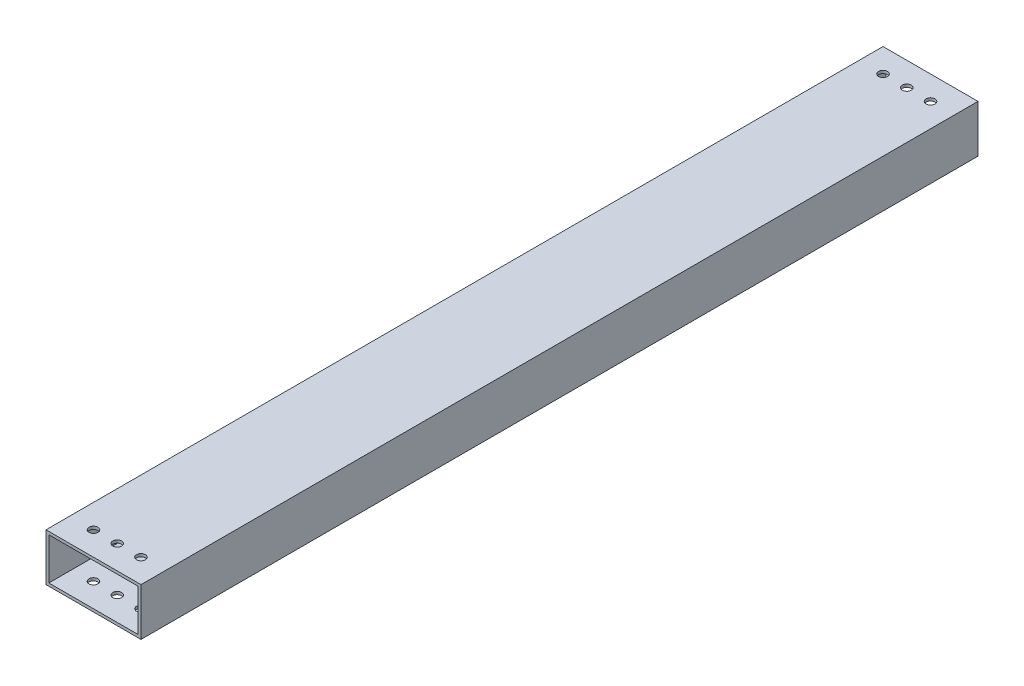
ISO-10303-21;
HEADER;
FILE_DESCRIPTION(('STEP AP214'),'2;1');
FILE_NAME('part.step','',(''),(''),'','','');
FILE_SCHEMA(('AUTOMOTIVE_DESIGN { 1 0 10303 214 1 1 1 1 }'));
ENDSEC;
DATA;
#1=APPLICATION_CONTEXT('core data for automotive mechanical design processes');
#2=APPLICATION_PROTOCOL_DEFINITION('international standard','automotive_design',2000,#1);
#3=PRODUCT_CONTEXT('',#1,'mechanical');
#4=PRODUCT('Part','Part','',(#3));
#5=PRODUCT_RELATED_PRODUCT_CATEGORY('part','',(#4));
#6=PRODUCT_DEFINITION_FORMATION('','',#4);
#7=PRODUCT_DEFINITION_CONTEXT('part definition',#1,'design');
#8=PRODUCT_DEFINITION('design','',#6,#7);
#9=PRODUCT_DEFINITION_SHAPE('','',#8);
#10=(LENGTH_UNIT() NAMED_UNIT(*) SI_UNIT(.MILLI.,.METRE.));
#11=(NAMED_UNIT(*) PLANE_ANGLE_UNIT() SI_UNIT($,.RADIAN.));
#12=(NAMED_UNIT(*) SI_UNIT($,.STERADIAN.) SOLID_ANGLE_UNIT());
#13=UNCERTAINTY_MEASURE_WITH_UNIT(LENGTH_MEASURE(1.E-05),#10,'distance_accuracy_value','');
#14=(GEOMETRIC_REPRESENTATION_CONTEXT(3) GLOBAL_UNCERTAINTY_ASSIGNED_CONTEXT((#13)) GLOBAL_UNIT_ASSIGNED_CONTEXT((#10,
#11,#12)) REPRESENTATION_CONTEXT('',''));
#15=CARTESIAN_POINT('',(0.,0.,0.));
#16=DIRECTION('',(0.,0.,1.));
#17=DIRECTION('',(1.,0.,0.));
#18=AXIS2_PLACEMENT_3D('',#15,#16,#17);
#19=CARTESIAN_POINT('',(0.,25.4,447.675));
#20=DIRECTION('',(0.,-1.,0.));
#21=DIRECTION('',(1.,0.,0.));
#22=AXIS2_PLACEMENT_3D('',#19,#20,#21);
#23=PLANE('',#22);
#24=CARTESIAN_POINT('',(-25.4,25.4,434.975));
#25=DIRECTION('',(0.,-1.,0.));
#26=DIRECTION('',(1.,0.,0.));
#27=AXIS2_PLACEMENT_3D('',#24,#25,#26);
#28=CIRCLE('',#27,2.38125000000003);
#29=CARTESIAN_POINT('',(-23.01875,25.4,434.975));
#30=VERTEX_POINT('',#29);
#31=EDGE_CURVE('E141',#30,#30,#28,.T.);
#32=ORIENTED_EDGE('',*,*,#31,.T.);
#33=EDGE_LOOP('',(#32));
#34=FACE_BOUND('',#33,.T.);
#35=CARTESIAN_POINT('',(-12.7,25.4,434.975));
#36=DIRECTION('',(0.,-1.,0.));
#37=DIRECTION('',(1.,0.,0.));
#38=AXIS2_PLACEMENT_3D('',#35,#36,#37);
#39=CIRCLE('',#38,2.38125000000003);
#40=CARTESIAN_POINT('',(-10.31875,25.4,434.975));
#41=VERTEX_POINT('',#40);
#42=EDGE_CURVE('E229',#41,#41,#39,.T.);
#43=ORIENTED_EDGE('',*,*,#42,.T.);
#44=EDGE_LOOP('',(#43));
#45=FACE_BOUND('',#44,.T.);
#46=CARTESIAN_POINT('',(-38.1,25.4,434.975));
#47=DIRECTION('',(0.,-1.,0.));
#48=DIRECTION('',(1.,0.,0.));
#49=AXIS2_PLACEMENT_3D('',#46,#47,#48);
#50=CIRCLE('',#49,2.38125000000002);
#51=CARTESIAN_POINT('',(-35.71875,25.4,434.975));
#52=VERTEX_POINT('',#51);
#53=EDGE_CURVE('E207',#52,#52,#50,.T.);
#54=ORIENTED_EDGE('',*,*,#53,.T.);
#55=EDGE_LOOP('',(#54));
#56=FACE_BOUND('',#55,.T.);
#57=DIRECTION('',(-1.,0.,0.));
#58=VECTOR('',#57,1.);
#59=CARTESIAN_POINT('',(0.,25.4,0.));
#60=LINE('',#59,#58);
#61=CARTESIAN_POINT('',(0.,25.4,0.));
#62=VERTEX_POINT('',#61);
#63=CARTESIAN_POINT('',(-50.8,25.4,0.));
#64=VERTEX_POINT('',#63);
#65=EDGE_CURVE('E178',#62,#64,#60,.T.);
#66=ORIENTED_EDGE('',*,*,#65,.T.);
#67=DIRECTION('',(0.,0.,-1.));
#68=VECTOR('',#67,1.);
#69=CARTESIAN_POINT('',(-50.8,25.4,447.675));
#70=LINE('',#69,#68);
#71=CARTESIAN_POINT('',(-50.8,25.4,447.675));
#72=VERTEX_POINT('',#71);
#73=EDGE_CURVE('E49',#72,#64,#70,.T.);
#74=ORIENTED_EDGE('',*,*,#73,.F.);
#75=DIRECTION('',(-1.,0.,0.));
#76=VECTOR('',#75,1.);
#77=CARTESIAN_POINT('',(0.,25.4,447.675));
#78=LINE('',#77,#76);
#79=CARTESIAN_POINT('',(0.,25.4,447.675));
#80=VERTEX_POINT('',#79);
#81=EDGE_CURVE('E162',#80,#72,#78,.T.);
#82=ORIENTED_EDGE('',*,*,#81,.F.);
#83=DIRECTION('',(0.,0.,-1.));
#84=VECTOR('',#83,1.);
#85=CARTESIAN_POINT('',(0.,25.4,447.675));
#86=LINE('',#85,#84);
#87=EDGE_CURVE('E11',#80,#62,#86,.T.);
#88=ORIENTED_EDGE('',*,*,#87,.T.);
#89=EDGE_LOOP('',(#66,#74,#82,#88));
#90=FACE_BOUND('',#89,.T.);
#91=CARTESIAN_POINT('',(-12.7,25.4,12.7));
#92=DIRECTION('',(0.,-1.,0.));
#93=DIRECTION('',(1.,0.,0.));
#94=AXIS2_PLACEMENT_3D('',#91,#92,#93);
#95=CIRCLE('',#94,2.38125000000003);
#96=CARTESIAN_POINT('',(-10.31875,25.4,12.7));
#97=VERTEX_POINT('',#96);
#98=EDGE_CURVE('E213',#97,#97,#95,.F.);
#99=ORIENTED_EDGE('',*,*,#98,.F.);
#100=EDGE_LOOP('',(#99));
#101=FACE_BOUND('',#100,.T.);
#102=CARTESIAN_POINT('',(-25.4,25.4,12.7));
#103=DIRECTION('',(0.,-1.,0.));
#104=DIRECTION('',(1.,0.,0.));
#105=AXIS2_PLACEMENT_3D('',#102,#103,#104);
#106=CIRCLE('',#105,2.38125000000003);
#107=CARTESIAN_POINT('',(-23.01875,25.4,12.7));
#108=VERTEX_POINT('',#107);
#109=EDGE_CURVE('E218',#108,#108,#106,.F.);
#110=ORIENTED_EDGE('',*,*,#109,.F.);
#111=EDGE_LOOP('',(#110));
#112=FACE_BOUND('',#111,.T.);
#113=CARTESIAN_POINT('',(-38.1,25.4,12.7));
#114=DIRECTION('',(0.,-1.,0.));
#115=DIRECTION('',(1.,0.,0.));
#116=AXIS2_PLACEMENT_3D('',#113,#114,#115);
#117=CIRCLE('',#116,2.38125000000002);
#118=CARTESIAN_POINT('',(-35.71875,25.4,12.7));
#119=VERTEX_POINT('',#118);
#120=EDGE_CURVE('E223',#119,#119,#117,.F.);
#121=ORIENTED_EDGE('',*,*,#120,.F.);
#122=EDGE_LOOP('',(#121));
#123=FACE_BOUND('',#122,.T.);
#124=ADVANCED_FACE('F39',(#34,#45,#56,#90,#101,#112,#123),#23,.F.);
#125=CARTESIAN_POINT('',(0.,0.,447.675));
#126=DIRECTION('',(0.,-1.,0.));
#127=DIRECTION('',(0.,0.,-1.));
#128=AXIS2_PLACEMENT_3D('',#125,#126,#127);
#129=PLANE('',#128);
#130=CARTESIAN_POINT('',(-25.4,0.,434.975));
#131=DIRECTION('',(0.,1.,0.));
#132=DIRECTION('',(-1.,0.,0.));
#133=AXIS2_PLACEMENT_3D('',#130,#131,#132);
#134=CIRCLE('',#133,2.38125000000003);
#135=CARTESIAN_POINT('',(-27.78125,0.,434.975));
#136=VERTEX_POINT('',#135);
#137=EDGE_CURVE('E339',#136,#136,#134,.T.);
#138=ORIENTED_EDGE('',*,*,#137,.T.);
#139=EDGE_LOOP('',(#138));
#140=FACE_BOUND('',#139,.T.);
#141=CARTESIAN_POINT('',(-12.7,0.,434.975));
#142=DIRECTION('',(0.,1.,0.));
#143=DIRECTION('',(-1.,0.,0.));
#144=AXIS2_PLACEMENT_3D('',#141,#142,#143);
#145=CIRCLE('',#144,2.38125000000003);
#146=CARTESIAN_POINT('',(-15.08125,0.,434.975));
#147=VERTEX_POINT('',#146);
#148=EDGE_CURVE('E333',#147,#147,#145,.T.);
#149=ORIENTED_EDGE('',*,*,#148,.T.);
#150=EDGE_LOOP('',(#149));
#151=FACE_BOUND('',#150,.T.);
#152=CARTESIAN_POINT('',(-25.4,0.,12.7));
#153=DIRECTION('',(0.,-1.,0.));
#154=DIRECTION('',(1.,0.,0.));
#155=AXIS2_PLACEMENT_3D('',#152,#153,#154);
#156=CIRCLE('',#155,2.38125000000003);
#157=CARTESIAN_POINT('',(-23.01875,0.,12.7));
#158=VERTEX_POINT('',#157);
#159=EDGE_CURVE('E334',#158,#158,#156,.T.);
#160=ORIENTED_EDGE('',*,*,#159,.F.);
#161=EDGE_LOOP('',(#160));
#162=FACE_BOUND('',#161,.T.);
#163=DIRECTION('',(-1.,0.,0.));
#164=VECTOR('',#163,1.);
#165=CARTESIAN_POINT('',(0.,0.,0.));
#166=LINE('',#165,#164);
#167=CARTESIAN_POINT('',(0.,0.,0.));
#168=VERTEX_POINT('',#167);
#169=CARTESIAN_POINT('',(-50.8,0.,0.));
#170=VERTEX_POINT('',#169);
#171=EDGE_CURVE('E163',#168,#170,#166,.T.);
#172=ORIENTED_EDGE('',*,*,#171,.F.);
#173=DIRECTION('',(0.,0.,-1.));
#174=VECTOR('',#173,1.);
#175=CARTESIAN_POINT('',(0.,0.,447.675));
#176=LINE('',#175,#174);
#177=CARTESIAN_POINT('',(0.,0.,447.675));
#178=VERTEX_POINT('',#177);
#179=EDGE_CURVE('E174',#178,#168,#176,.T.);
#180=ORIENTED_EDGE('',*,*,#179,.F.);
#181=DIRECTION('',(-1.,0.,0.));
#182=VECTOR('',#181,1.);
#183=CARTESIAN_POINT('',(0.,0.,447.675));
#184=LINE('',#183,#182);
#185=CARTESIAN_POINT('',(-50.8,0.,447.675));
#186=VERTEX_POINT('',#185);
#187=EDGE_CURVE('E170',#178,#186,#184,.T.);
#188=ORIENTED_EDGE('',*,*,#187,.T.);
#189=DIRECTION('',(0.,0.,-1.));
#190=VECTOR('',#189,1.);
#191=CARTESIAN_POINT('',(-50.8,0.,447.675));
#192=LINE('',#191,#190);
#193=EDGE_CURVE('E191',#186,#170,#192,.T.);
#194=ORIENTED_EDGE('',*,*,#193,.T.);
#195=EDGE_LOOP('',(#172,#180,#188,#194));
#196=FACE_BOUND('',#195,.T.);
#197=CARTESIAN_POINT('',(-38.1,0.,434.975));
#198=DIRECTION('',(0.,1.,0.));
#199=DIRECTION('',(-1.,0.,0.));
#200=AXIS2_PLACEMENT_3D('',#197,#198,#199);
#201=CIRCLE('',#200,2.38125000000002);
#202=CARTESIAN_POINT('',(-40.48125,0.,434.975));
#203=VERTEX_POINT('',#202);
#204=EDGE_CURVE('E201',#203,#203,#201,.T.);
#205=ORIENTED_EDGE('',*,*,#204,.T.);
#206=EDGE_LOOP('',(#205));
#207=FACE_BOUND('',#206,.T.);
#208=CARTESIAN_POINT('',(-12.7,0.,12.7));
#209=DIRECTION('',(0.,-1.,0.));
#210=DIRECTION('',(1.,0.,0.));
#211=AXIS2_PLACEMENT_3D('',#208,#209,#210);
#212=CIRCLE('',#211,2.38125000000003);
#213=CARTESIAN_POINT('',(-10.31875,0.,12.7));
#214=VERTEX_POINT('',#213);
#215=EDGE_CURVE('E342',#214,#214,#212,.T.);
#216=ORIENTED_EDGE('',*,*,#215,.F.);
#217=EDGE_LOOP('',(#216));
#218=FACE_BOUND('',#217,.T.);
#219=CARTESIAN_POINT('',(-38.1,0.,12.7));
#220=DIRECTION('',(0.,-1.,0.));
#221=DIRECTION('',(1.,0.,0.));
#222=AXIS2_PLACEMENT_3D('',#219,#220,#221);
#223=CIRCLE('',#222,2.38125000000002);
#224=CARTESIAN_POINT('',(-35.71875,0.,12.7));
#225=VERTEX_POINT('',#224);
#226=EDGE_CURVE('E328',#225,#225,#223,.T.);
#227=ORIENTED_EDGE('',*,*,#226,.F.);
#228=EDGE_LOOP('',(#227));
#229=FACE_BOUND('',#228,.T.);
#230=ADVANCED_FACE('F270',(#140,#151,#162,#196,#207,#218,#229),#129,.T.);
#231=CARTESIAN_POINT('',(0.,23.876,447.675));
#232=DIRECTION('',(0.,-1.,0.));
#233=DIRECTION('',(1.,0.,0.));
#234=AXIS2_PLACEMENT_3D('',#231,#232,#233);
#235=PLANE('',#234);
#236=CARTESIAN_POINT('',(-25.4,23.876,434.975));
#237=DIRECTION('',(0.,-1.,0.));
#238=DIRECTION('',(1.,0.,0.));
#239=AXIS2_PLACEMENT_3D('',#236,#237,#238);
#240=CIRCLE('',#239,2.38125000000003);
#241=CARTESIAN_POINT('',(-23.01875,23.876,434.975));
#242=VERTEX_POINT('',#241);
#243=EDGE_CURVE('E243',#242,#242,#240,.T.);
#244=ORIENTED_EDGE('',*,*,#243,.F.);
#245=EDGE_LOOP('',(#244));
#246=FACE_BOUND('',#245,.T.);
#247=CARTESIAN_POINT('',(-12.7,23.876,434.975));
#248=DIRECTION('',(0.,-1.,0.));
#249=DIRECTION('',(1.,0.,0.));
#250=AXIS2_PLACEMENT_3D('',#247,#248,#249);
#251=CIRCLE('',#250,2.38125000000003);
#252=CARTESIAN_POINT('',(-10.31875,23.876,434.975));
#253=VERTEX_POINT('',#252);
#254=EDGE_CURVE('E222',#253,#253,#251,.T.);
#255=ORIENTED_EDGE('',*,*,#254,.F.);
#256=EDGE_LOOP('',(#255));
#257=FACE_BOUND('',#256,.T.);
#258=CARTESIAN_POINT('',(-25.4,23.876,12.7));
#259=DIRECTION('',(0.,-1.,0.));
#260=DIRECTION('',(1.,0.,0.));
#261=AXIS2_PLACEMENT_3D('',#258,#259,#260);
#262=CIRCLE('',#261,2.38125000000003);
#263=CARTESIAN_POINT('',(-23.01875,23.876,12.7));
#264=VERTEX_POINT('',#263);
#265=EDGE_CURVE('E212',#264,#264,#262,.F.);
#266=ORIENTED_EDGE('',*,*,#265,.T.);
#267=EDGE_LOOP('',(#266));
#268=FACE_BOUND('',#267,.T.);
#269=DIRECTION('',(-1.,0.,0.));
#270=VECTOR('',#269,1.);
#271=CARTESIAN_POINT('',(0.,23.876,0.));
#272=LINE('',#271,#270);
#273=CARTESIAN_POINT('',(-1.524,23.876,0.));
#274=VERTEX_POINT('',#273);
#275=CARTESIAN_POINT('',(-49.276,23.876,0.));
#276=VERTEX_POINT('',#275);
#277=EDGE_CURVE('E124',#274,#276,#272,.T.);
#278=ORIENTED_EDGE('',*,*,#277,.F.);
#279=DIRECTION('',(0.,0.,-1.));
#280=VECTOR('',#279,1.);
#281=CARTESIAN_POINT('',(-1.524,23.876,447.675));
#282=LINE('',#281,#280);
#283=CARTESIAN_POINT('',(-1.524,23.876,447.675));
#284=VERTEX_POINT('',#283);
#285=EDGE_CURVE('E110',#284,#274,#282,.T.);
#286=ORIENTED_EDGE('',*,*,#285,.F.);
#287=DIRECTION('',(-1.,0.,0.));
#288=VECTOR('',#287,1.);
#289=CARTESIAN_POINT('',(0.,23.876,447.675));
#290=LINE('',#289,#288);
#291=CARTESIAN_POINT('',(-49.276,23.876,447.675));
#292=VERTEX_POINT('',#291);
#293=EDGE_CURVE('E117',#284,#292,#290,.T.);
#294=ORIENTED_EDGE('',*,*,#293,.T.);
#295=DIRECTION('',(0.,0.,-1.));
#296=VECTOR('',#295,1.);
#297=CARTESIAN_POINT('',(-49.276,23.876,447.675));
#298=LINE('',#297,#296);
#299=EDGE_CURVE('E127',#292,#276,#298,.T.);
#300=ORIENTED_EDGE('',*,*,#299,.T.);
#301=EDGE_LOOP('',(#278,#286,#294,#300));
#302=FACE_BOUND('',#301,.T.);
#303=CARTESIAN_POINT('',(-38.1,23.876,434.975));
#304=DIRECTION('',(0.,-1.,0.));
#305=DIRECTION('',(1.,0.,0.));
#306=AXIS2_PLACEMENT_3D('',#303,#304,#305);
#307=CIRCLE('',#306,2.38125000000002);
#308=CARTESIAN_POINT('',(-35.71875,23.876,434.975));
#309=VERTEX_POINT('',#308);
#310=EDGE_CURVE('E200',#309,#309,#307,.T.);
#311=ORIENTED_EDGE('',*,*,#310,.F.);
#312=EDGE_LOOP('',(#311));
#313=FACE_BOUND('',#312,.T.);
#314=CARTESIAN_POINT('',(-12.7,23.876,12.7));
#315=DIRECTION('',(0.,-1.,0.));
#316=DIRECTION('',(1.,0.,0.));
#317=AXIS2_PLACEMENT_3D('',#314,#315,#316);
#318=CIRCLE('',#317,2.38125000000003);
#319=CARTESIAN_POINT('',(-10.31875,23.876,12.7));
#320=VERTEX_POINT('',#319);
#321=EDGE_CURVE('E206',#320,#320,#318,.F.);
#322=ORIENTED_EDGE('',*,*,#321,.T.);
#323=EDGE_LOOP('',(#322));
#324=FACE_BOUND('',#323,.T.);
#325=CARTESIAN_POINT('',(-38.1,23.876,12.7));
#326=DIRECTION('',(0.,-1.,0.));
#327=DIRECTION('',(1.,0.,0.));
#328=AXIS2_PLACEMENT_3D('',#325,#326,#327);
#329=CIRCLE('',#328,2.38125000000002);
#330=CARTESIAN_POINT('',(-35.71875,23.876,12.7));
#331=VERTEX_POINT('',#330);
#332=EDGE_CURVE('E217',#331,#331,#329,.F.);
#333=ORIENTED_EDGE('',*,*,#332,.T.);
#334=EDGE_LOOP('',(#333));
#335=FACE_BOUND('',#334,.T.);
#336=ADVANCED_FACE('F121',(#246,#257,#268,#302,#313,#324,#335),#235,.T.);
#337=CARTESIAN_POINT('',(0.,1.524,447.675));
#338=DIRECTION('',(0.,-1.,0.));
#339=DIRECTION('',(0.,0.,-1.));
#340=AXIS2_PLACEMENT_3D('',#337,#338,#339);
#341=PLANE('',#340);
#342=CARTESIAN_POINT('',(-25.4,1.524,434.975));
#343=DIRECTION('',(0.,-1.,0.));
#344=DIRECTION('',(0.,0.,-1.));
#345=AXIS2_PLACEMENT_3D('',#342,#343,#344);
#346=CIRCLE('',#345,2.38125000000003);
#347=CARTESIAN_POINT('',(-25.4,1.524,432.59375));
#348=VERTEX_POINT('',#347);
#349=EDGE_CURVE('E43',#348,#348,#346,.T.);
#350=ORIENTED_EDGE('',*,*,#349,.T.);
#351=EDGE_LOOP('',(#350));
#352=FACE_BOUND('',#351,.T.);
#353=CARTESIAN_POINT('',(-12.7,1.524,434.975));
#354=DIRECTION('',(0.,-1.,0.));
#355=DIRECTION('',(0.,0.,-1.));
#356=AXIS2_PLACEMENT_3D('',#353,#354,#355);
#357=CIRCLE('',#356,2.38125000000003);
#358=CARTESIAN_POINT('',(-12.7,1.524,432.59375));
#359=VERTEX_POINT('',#358);
#360=EDGE_CURVE('E219',#359,#359,#357,.T.);
#361=ORIENTED_EDGE('',*,*,#360,.T.);
#362=EDGE_LOOP('',(#361));
#363=FACE_BOUND('',#362,.T.);
#364=CARTESIAN_POINT('',(-38.1,1.524,434.975));
#365=DIRECTION('',(0.,-1.,0.));
#366=DIRECTION('',(0.,0.,-1.));
#367=AXIS2_PLACEMENT_3D('',#364,#365,#366);
#368=CIRCLE('',#367,2.38125000000002);
#369=CARTESIAN_POINT('',(-38.1,1.524,432.59375));
#370=VERTEX_POINT('',#369);
#371=EDGE_CURVE('E196',#370,#370,#368,.T.);
#372=ORIENTED_EDGE('',*,*,#371,.T.);
#373=EDGE_LOOP('',(#372));
#374=FACE_BOUND('',#373,.T.);
#375=DIRECTION('',(-1.,0.,0.));
#376=VECTOR('',#375,1.);
#377=CARTESIAN_POINT('',(0.,1.524,0.));
#378=LINE('',#377,#376);
#379=CARTESIAN_POINT('',(-1.524,1.524,0.));
#380=VERTEX_POINT('',#379);
#381=CARTESIAN_POINT('',(-49.276,1.524,0.));
#382=VERTEX_POINT('',#381);
#383=EDGE_CURVE('E118',#380,#382,#378,.T.);
#384=ORIENTED_EDGE('',*,*,#383,.T.);
#385=DIRECTION('',(0.,0.,-1.));
#386=VECTOR('',#385,1.);
#387=CARTESIAN_POINT('',(-49.276,1.524,447.675));
#388=LINE('',#387,#386);
#389=CARTESIAN_POINT('',(-49.276,1.524,447.675));
#390=VERTEX_POINT('',#389);
#391=EDGE_CURVE('E153',#390,#382,#388,.T.);
#392=ORIENTED_EDGE('',*,*,#391,.F.);
#393=DIRECTION('',(-1.,0.,0.));
#394=VECTOR('',#393,1.);
#395=CARTESIAN_POINT('',(0.,1.524,447.675));
#396=LINE('',#395,#394);
#397=CARTESIAN_POINT('',(-1.524,1.524,447.675));
#398=VERTEX_POINT('',#397);
#399=EDGE_CURVE('E133',#398,#390,#396,.T.);
#400=ORIENTED_EDGE('',*,*,#399,.F.);
#401=DIRECTION('',(0.,0.,-1.));
#402=VECTOR('',#401,1.);
#403=CARTESIAN_POINT('',(-1.524,1.524,447.675));
#404=LINE('',#403,#402);
#405=EDGE_CURVE('E111',#398,#380,#404,.T.);
#406=ORIENTED_EDGE('',*,*,#405,.T.);
#407=EDGE_LOOP('',(#384,#392,#400,#406));
#408=FACE_BOUND('',#407,.T.);
#409=CARTESIAN_POINT('',(-12.7,1.524,12.7));
#410=DIRECTION('',(0.,-1.,0.));
#411=DIRECTION('',(0.,0.,-1.));
#412=AXIS2_PLACEMENT_3D('',#409,#410,#411);
#413=CIRCLE('',#412,2.38125000000003);
#414=CARTESIAN_POINT('',(-12.7,1.524,10.31875));
#415=VERTEX_POINT('',#414);
#416=EDGE_CURVE('E202',#415,#415,#413,.F.);
#417=ORIENTED_EDGE('',*,*,#416,.F.);
#418=EDGE_LOOP('',(#417));
#419=FACE_BOUND('',#418,.T.);
#420=CARTESIAN_POINT('',(-25.4,1.524,12.7));
#421=DIRECTION('',(0.,-1.,0.));
#422=DIRECTION('',(0.,0.,-1.));
#423=AXIS2_PLACEMENT_3D('',#420,#421,#422);
#424=CIRCLE('',#423,2.38125000000003);
#425=CARTESIAN_POINT('',(-25.4,1.524,10.31875));
#426=VERTEX_POINT('',#425);
#427=EDGE_CURVE('E208',#426,#426,#424,.F.);
#428=ORIENTED_EDGE('',*,*,#427,.F.);
#429=EDGE_LOOP('',(#428));
#430=FACE_BOUND('',#429,.T.);
#431=CARTESIAN_POINT('',(-38.1,1.524,12.7));
#432=DIRECTION('',(0.,-1.,0.));
#433=DIRECTION('',(0.,0.,-1.));
#434=AXIS2_PLACEMENT_3D('',#431,#432,#433);
#435=CIRCLE('',#434,2.38125000000002);
#436=CARTESIAN_POINT('',(-38.1,1.524,10.31875));
#437=VERTEX_POINT('',#436);
#438=EDGE_CURVE('E214',#437,#437,#435,.F.);
#439=ORIENTED_EDGE('',*,*,#438,.F.);
#440=EDGE_LOOP('',(#439));
#441=FACE_BOUND('',#440,.T.);
#442=ADVANCED_FACE('F287',(#352,#363,#374,#408,#419,#430,#441),#341,.F.);
#443=CARTESIAN_POINT('',(0.,0.,447.675));
#444=DIRECTION('',(0.,0.,1.));
#445=DIRECTION('',(1.,0.,0.));
#446=AXIS2_PLACEMENT_3D('',#443,#444,#445);
#447=PLANE('',#446);
#448=DIRECTION('',(0.,1.,0.));
#449=VECTOR('',#448,1.);
#450=CARTESIAN_POINT('',(0.,0.,447.675));
#451=LINE('',#450,#449);
#452=EDGE_CURVE('E158',#178,#80,#451,.T.);
#453=ORIENTED_EDGE('',*,*,#452,.T.);
#454=ORIENTED_EDGE('',*,*,#81,.T.);
#455=DIRECTION('',(0.,1.,0.));
#456=VECTOR('',#455,1.);
#457=CARTESIAN_POINT('',(-50.8,0.,447.675));
#458=LINE('',#457,#456);
#459=EDGE_CURVE('E166',#186,#72,#458,.T.);
#460=ORIENTED_EDGE('',*,*,#459,.F.);
#461=ORIENTED_EDGE('',*,*,#187,.F.);
#462=EDGE_LOOP('',(#453,#454,#460,#461));
#463=FACE_BOUND('',#462,.T.);
#464=ORIENTED_EDGE('',*,*,#293,.F.);
#465=DIRECTION('',(0.,1.,0.));
#466=VECTOR('',#465,1.);
#467=CARTESIAN_POINT('',(-1.524,0.,447.675));
#468=LINE('',#467,#466);
#469=EDGE_CURVE('E107',#398,#284,#468,.T.);
#470=ORIENTED_EDGE('',*,*,#469,.F.);
#471=ORIENTED_EDGE('',*,*,#399,.T.);
#472=DIRECTION('',(0.,1.,0.));
#473=VECTOR('',#472,1.);
#474=CARTESIAN_POINT('',(-49.276,0.,447.675));
#475=LINE('',#474,#473);
#476=EDGE_CURVE('E57',#390,#292,#475,.T.);
#477=ORIENTED_EDGE('',*,*,#476,.T.);
#478=EDGE_LOOP('',(#464,#470,#471,#477));
#479=FACE_BOUND('',#478,.T.);
#480=ADVANCED_FACE('F129',(#463,#479),#447,.T.);
#481=CARTESIAN_POINT('',(0.,0.,0.));
#482=DIRECTION('',(0.,0.,1.));
#483=DIRECTION('',(1.,0.,0.));
#484=AXIS2_PLACEMENT_3D('',#481,#482,#483);
#485=PLANE('',#484);
#486=DIRECTION('',(0.,1.,0.));
#487=VECTOR('',#486,1.);
#488=CARTESIAN_POINT('',(0.,0.,0.));
#489=LINE('',#488,#487);
#490=EDGE_CURVE('E126',#168,#62,#489,.T.);
#491=ORIENTED_EDGE('',*,*,#490,.F.);
#492=ORIENTED_EDGE('',*,*,#171,.T.);
#493=DIRECTION('',(0.,1.,0.));
#494=VECTOR('',#493,1.);
#495=CARTESIAN_POINT('',(-50.8,0.,0.));
#496=LINE('',#495,#494);
#497=EDGE_CURVE('E182',#170,#64,#496,.T.);
#498=ORIENTED_EDGE('',*,*,#497,.T.);
#499=ORIENTED_EDGE('',*,*,#65,.F.);
#500=EDGE_LOOP('',(#491,#492,#498,#499));
#501=FACE_BOUND('',#500,.T.);
#502=DIRECTION('',(0.,1.,0.));
#503=VECTOR('',#502,1.);
#504=CARTESIAN_POINT('',(-1.524,0.,0.));
#505=LINE('',#504,#503);
#506=EDGE_CURVE('E65',#380,#274,#505,.T.);
#507=ORIENTED_EDGE('',*,*,#506,.T.);
#508=ORIENTED_EDGE('',*,*,#277,.T.);
#509=DIRECTION('',(0.,1.,0.));
#510=VECTOR('',#509,1.);
#511=CARTESIAN_POINT('',(-49.276,0.,0.));
#512=LINE('',#511,#510);
#513=EDGE_CURVE('E144',#382,#276,#512,.T.);
#514=ORIENTED_EDGE('',*,*,#513,.F.);
#515=ORIENTED_EDGE('',*,*,#383,.F.);
#516=EDGE_LOOP('',(#507,#508,#514,#515));
#517=FACE_BOUND('',#516,.T.);
#518=ADVANCED_FACE('F281',(#501,#517),#485,.F.);
#519=CARTESIAN_POINT('',(0.,0.,447.675));
#520=DIRECTION('',(-1.,0.,0.));
#521=DIRECTION('',(0.,-1.,0.));
#522=AXIS2_PLACEMENT_3D('',#519,#520,#521);
#523=PLANE('',#522);
#524=ORIENTED_EDGE('',*,*,#490,.T.);
#525=ORIENTED_EDGE('',*,*,#87,.F.);
#526=ORIENTED_EDGE('',*,*,#452,.F.);
#527=ORIENTED_EDGE('',*,*,#179,.T.);
#528=EDGE_LOOP('',(#524,#525,#526,#527));
#529=FACE_BOUND('',#528,.T.);
#530=ADVANCED_FACE('F41',(#529),#523,.F.);
#531=CARTESIAN_POINT('',(-50.8,0.,447.675));
#532=DIRECTION('',(-1.,0.,0.));
#533=DIRECTION('',(0.,0.,1.));
#534=AXIS2_PLACEMENT_3D('',#531,#532,#533);
#535=PLANE('',#534);
#536=ORIENTED_EDGE('',*,*,#497,.F.);
#537=ORIENTED_EDGE('',*,*,#193,.F.);
#538=ORIENTED_EDGE('',*,*,#459,.T.);
#539=ORIENTED_EDGE('',*,*,#73,.T.);
#540=EDGE_LOOP('',(#536,#537,#538,#539));
#541=FACE_BOUND('',#540,.T.);
#542=ADVANCED_FACE('F277',(#541),#535,.T.);
#543=CARTESIAN_POINT('',(-1.524,0.,447.675));
#544=DIRECTION('',(-1.,0.,0.));
#545=DIRECTION('',(0.,-1.,0.));
#546=AXIS2_PLACEMENT_3D('',#543,#544,#545);
#547=PLANE('',#546);
#548=ORIENTED_EDGE('',*,*,#506,.F.);
#549=ORIENTED_EDGE('',*,*,#405,.F.);
#550=ORIENTED_EDGE('',*,*,#469,.T.);
#551=ORIENTED_EDGE('',*,*,#285,.T.);
#552=EDGE_LOOP('',(#548,#549,#550,#551));
#553=FACE_BOUND('',#552,.T.);
#554=ADVANCED_FACE('F109',(#553),#547,.T.);
#555=CARTESIAN_POINT('',(-49.276,0.,447.675));
#556=DIRECTION('',(-1.,0.,0.));
#557=DIRECTION('',(0.,0.,1.));
#558=AXIS2_PLACEMENT_3D('',#555,#556,#557);
#559=PLANE('',#558);
#560=ORIENTED_EDGE('',*,*,#513,.T.);
#561=ORIENTED_EDGE('',*,*,#299,.F.);
#562=ORIENTED_EDGE('',*,*,#476,.F.);
#563=ORIENTED_EDGE('',*,*,#391,.T.);
#564=EDGE_LOOP('',(#560,#561,#562,#563));
#565=FACE_BOUND('',#564,.T.);
#566=ADVANCED_FACE('F291',(#565),#559,.F.);
#567=CARTESIAN_POINT('',(-38.1,0.,434.975));
#568=DIRECTION('',(0.,1.,0.));
#569=DIRECTION('',(-1.,0.,0.));
#570=AXIS2_PLACEMENT_3D('',#567,#568,#569);
#571=CYLINDRICAL_SURFACE('',#570,2.38125000000002);
#572=ORIENTED_EDGE('',*,*,#204,.F.);
#573=EDGE_LOOP('',(#572));
#574=FACE_BOUND('',#573,.T.);
#575=ORIENTED_EDGE('',*,*,#371,.F.);
#576=EDGE_LOOP('',(#575));
#577=FACE_BOUND('',#576,.T.);
#578=ADVANCED_FACE('F297',(#574,#577),#571,.F.);
#579=CARTESIAN_POINT('',(-12.7,0.,12.7));
#580=DIRECTION('',(0.,1.,0.));
#581=DIRECTION('',(-1.,0.,0.));
#582=AXIS2_PLACEMENT_3D('',#579,#580,#581);
#583=CYLINDRICAL_SURFACE('',#582,2.38125000000003);
#584=ORIENTED_EDGE('',*,*,#215,.T.);
#585=EDGE_LOOP('',(#584));
#586=FACE_BOUND('',#585,.T.);
#587=ORIENTED_EDGE('',*,*,#416,.T.);
#588=EDGE_LOOP('',(#587));
#589=FACE_BOUND('',#588,.T.);
#590=ADVANCED_FACE('F323',(#586,#589),#583,.F.);
#591=CARTESIAN_POINT('',(-25.4,0.,12.7));
#592=DIRECTION('',(0.,1.,0.));
#593=DIRECTION('',(-1.,0.,0.));
#594=AXIS2_PLACEMENT_3D('',#591,#592,#593);
#595=CYLINDRICAL_SURFACE('',#594,2.38125000000003);
#596=ORIENTED_EDGE('',*,*,#159,.T.);
#597=EDGE_LOOP('',(#596));
#598=FACE_BOUND('',#597,.T.);
#599=ORIENTED_EDGE('',*,*,#427,.T.);
#600=EDGE_LOOP('',(#599));
#601=FACE_BOUND('',#600,.T.);
#602=ADVANCED_FACE('F309',(#598,#601),#595,.F.);
#603=CARTESIAN_POINT('',(-38.1,0.,12.7));
#604=DIRECTION('',(0.,1.,0.));
#605=DIRECTION('',(-1.,0.,0.));
#606=AXIS2_PLACEMENT_3D('',#603,#604,#605);
#607=CYLINDRICAL_SURFACE('',#606,2.38125000000002);
#608=ORIENTED_EDGE('',*,*,#226,.T.);
#609=EDGE_LOOP('',(#608));
#610=FACE_BOUND('',#609,.T.);
#611=ORIENTED_EDGE('',*,*,#438,.T.);
#612=EDGE_LOOP('',(#611));
#613=FACE_BOUND('',#612,.T.);
#614=ADVANCED_FACE('F312',(#610,#613),#607,.F.);
#615=CARTESIAN_POINT('',(-12.7,0.,434.975));
#616=DIRECTION('',(0.,1.,0.));
#617=DIRECTION('',(-1.,0.,0.));
#618=AXIS2_PLACEMENT_3D('',#615,#616,#617);
#619=CYLINDRICAL_SURFACE('',#618,2.38125000000003);
#620=ORIENTED_EDGE('',*,*,#148,.F.);
#621=EDGE_LOOP('',(#620));
#622=FACE_BOUND('',#621,.T.);
#623=ORIENTED_EDGE('',*,*,#360,.F.);
#624=EDGE_LOOP('',(#623));
#625=FACE_BOUND('',#624,.T.);
#626=ADVANCED_FACE('F264',(#622,#625),#619,.F.);
#627=CARTESIAN_POINT('',(-25.4,0.,434.975));
#628=DIRECTION('',(0.,1.,0.));
#629=DIRECTION('',(-1.,0.,0.));
#630=AXIS2_PLACEMENT_3D('',#627,#628,#629);
#631=CYLINDRICAL_SURFACE('',#630,2.38125000000003);
#632=ORIENTED_EDGE('',*,*,#137,.F.);
#633=EDGE_LOOP('',(#632));
#634=FACE_BOUND('',#633,.T.);
#635=ORIENTED_EDGE('',*,*,#349,.F.);
#636=EDGE_LOOP('',(#635));
#637=FACE_BOUND('',#636,.T.);
#638=ADVANCED_FACE('F257',(#634,#637),#631,.F.);
#639=ORIENTED_EDGE('',*,*,#310,.T.);
#640=EDGE_LOOP('',(#639));
#641=FACE_BOUND('',#640,.T.);
#642=ORIENTED_EDGE('',*,*,#53,.F.);
#643=EDGE_LOOP('',(#642));
#644=FACE_BOUND('',#643,.T.);
#645=ADVANCED_FACE('F267',(#641,#644),#571,.F.);
#646=ORIENTED_EDGE('',*,*,#321,.F.);
#647=EDGE_LOOP('',(#646));
#648=FACE_BOUND('',#647,.T.);
#649=ORIENTED_EDGE('',*,*,#98,.T.);
#650=EDGE_LOOP('',(#649));
#651=FACE_BOUND('',#650,.T.);
#652=ADVANCED_FACE('F303',(#648,#651),#583,.F.);
#653=ORIENTED_EDGE('',*,*,#265,.F.);
#654=EDGE_LOOP('',(#653));
#655=FACE_BOUND('',#654,.T.);
#656=ORIENTED_EDGE('',*,*,#109,.T.);
#657=EDGE_LOOP('',(#656));
#658=FACE_BOUND('',#657,.T.);
#659=ADVANCED_FACE('F305',(#655,#658),#595,.F.);
#660=ORIENTED_EDGE('',*,*,#332,.F.);
#661=EDGE_LOOP('',(#660));
#662=FACE_BOUND('',#661,.T.);
#663=ORIENTED_EDGE('',*,*,#120,.T.);
#664=EDGE_LOOP('',(#663));
#665=FACE_BOUND('',#664,.T.);
#666=ADVANCED_FACE('F261',(#662,#665),#607,.F.);
#667=ORIENTED_EDGE('',*,*,#254,.T.);
#668=EDGE_LOOP('',(#667));
#669=FACE_BOUND('',#668,.T.);
#670=ORIENTED_EDGE('',*,*,#42,.F.);
#671=EDGE_LOOP('',(#670));
#672=FACE_BOUND('',#671,.T.);
#673=ADVANCED_FACE('F254',(#669,#672),#619,.F.);
#674=ORIENTED_EDGE('',*,*,#243,.T.);
#675=EDGE_LOOP('',(#674));
#676=FACE_BOUND('',#675,.T.);
#677=ORIENTED_EDGE('',*,*,#31,.F.);
#678=EDGE_LOOP('',(#677));
#679=FACE_BOUND('',#678,.T.);
#680=ADVANCED_FACE('F252',(#676,#679),#631,.F.);
#681=CLOSED_SHELL('',(#124,#230,#336,#442,#480,#518,#530,#542,#554,#566,#578,#590,#602,#614,
#626,#638,#645,#652,#659,#666,#673,#680));
#682=MANIFOLD_SOLID_BREP('B2',#681);
#683=ADVANCED_BREP_SHAPE_REPRESENTATION('',(#18,#682),#14);
#684=SHAPE_DEFINITION_REPRESENTATION(#9,#683);
ENDSEC;
END-ISO-10303-21;
